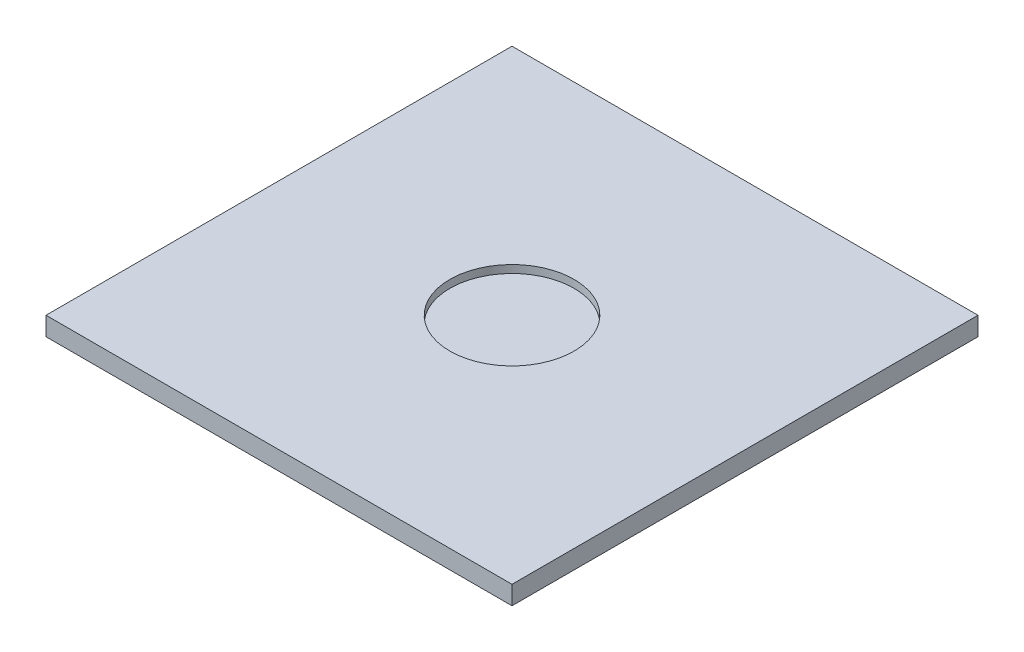
ISO-10303-21;
HEADER;
FILE_DESCRIPTION(('STEP AP214'),'2;1');
FILE_NAME('part.step','',(''),(''),'','','');
FILE_SCHEMA(('AUTOMOTIVE_DESIGN { 1 0 10303 214 1 1 1 1 }'));
ENDSEC;
DATA;
#1=APPLICATION_CONTEXT('core data for automotive mechanical design processes');
#2=APPLICATION_PROTOCOL_DEFINITION('international standard','automotive_design',2000,#1);
#3=PRODUCT_CONTEXT('',#1,'mechanical');
#4=PRODUCT('Part','Part','',(#3));
#5=PRODUCT_RELATED_PRODUCT_CATEGORY('part','',(#4));
#6=PRODUCT_DEFINITION_FORMATION('','',#4);
#7=PRODUCT_DEFINITION_CONTEXT('part definition',#1,'design');
#8=PRODUCT_DEFINITION('design','',#6,#7);
#9=PRODUCT_DEFINITION_SHAPE('','',#8);
#10=(LENGTH_UNIT() NAMED_UNIT(*) SI_UNIT(.MILLI.,.METRE.));
#11=(NAMED_UNIT(*) PLANE_ANGLE_UNIT() SI_UNIT($,.RADIAN.));
#12=(NAMED_UNIT(*) SI_UNIT($,.STERADIAN.) SOLID_ANGLE_UNIT());
#13=UNCERTAINTY_MEASURE_WITH_UNIT(LENGTH_MEASURE(1.E-05),#10,'distance_accuracy_value','');
#14=(GEOMETRIC_REPRESENTATION_CONTEXT(3) GLOBAL_UNCERTAINTY_ASSIGNED_CONTEXT((#13)) GLOBAL_UNIT_ASSIGNED_CONTEXT((#10,
#11,#12)) REPRESENTATION_CONTEXT('',''));
#15=CARTESIAN_POINT('',(0.,0.,0.));
#16=DIRECTION('',(0.,0.,1.));
#17=DIRECTION('',(1.,0.,0.));
#18=AXIS2_PLACEMENT_3D('',#15,#16,#17);
#19=CARTESIAN_POINT('',(150.,12.,-150.));
#20=DIRECTION('',(-1.,0.,0.));
#21=DIRECTION('',(0.,0.,1.));
#22=AXIS2_PLACEMENT_3D('',#19,#20,#21);
#23=PLANE('',#22);
#24=DIRECTION('',(0.,0.,-1.));
#25=VECTOR('',#24,1.);
#26=CARTESIAN_POINT('',(150.,0.,-150.));
#27=LINE('',#26,#25);
#28=CARTESIAN_POINT('',(150.,0.,150.));
#29=VERTEX_POINT('',#28);
#30=CARTESIAN_POINT('',(150.,0.,-150.));
#31=VERTEX_POINT('',#30);
#32=EDGE_CURVE('E84',#29,#31,#27,.T.);
#33=ORIENTED_EDGE('',*,*,#32,.T.);
#34=DIRECTION('',(0.,-1.,0.));
#35=VECTOR('',#34,1.);
#36=CARTESIAN_POINT('',(150.,12.,-150.));
#37=LINE('',#36,#35);
#38=CARTESIAN_POINT('',(150.,12.,-150.));
#39=VERTEX_POINT('',#38);
#40=EDGE_CURVE('E9',#39,#31,#37,.T.);
#41=ORIENTED_EDGE('',*,*,#40,.F.);
#42=DIRECTION('',(0.,0.,-1.));
#43=VECTOR('',#42,1.);
#44=CARTESIAN_POINT('',(150.,12.,-150.));
#45=LINE('',#44,#43);
#46=CARTESIAN_POINT('',(150.,12.,150.));
#47=VERTEX_POINT('',#46);
#48=EDGE_CURVE('E67',#47,#39,#45,.T.);
#49=ORIENTED_EDGE('',*,*,#48,.F.);
#50=DIRECTION('',(0.,-1.,0.));
#51=VECTOR('',#50,1.);
#52=CARTESIAN_POINT('',(150.,12.,150.));
#53=LINE('',#52,#51);
#54=EDGE_CURVE('E80',#47,#29,#53,.T.);
#55=ORIENTED_EDGE('',*,*,#54,.T.);
#56=EDGE_LOOP('',(#33,#41,#49,#55));
#57=FACE_BOUND('',#56,.T.);
#58=ADVANCED_FACE('F15',(#57),#23,.F.);
#59=CARTESIAN_POINT('',(-150.,12.,-150.));
#60=DIRECTION('',(0.,0.,1.));
#61=DIRECTION('',(1.,0.,0.));
#62=AXIS2_PLACEMENT_3D('',#59,#60,#61);
#63=PLANE('',#62);
#64=DIRECTION('',(-1.,0.,0.));
#65=VECTOR('',#64,1.);
#66=CARTESIAN_POINT('',(-150.,0.,-150.));
#67=LINE('',#66,#65);
#68=CARTESIAN_POINT('',(-150.,0.,-150.));
#69=VERTEX_POINT('',#68);
#70=EDGE_CURVE('E72',#31,#69,#67,.T.);
#71=ORIENTED_EDGE('',*,*,#70,.T.);
#72=DIRECTION('',(0.,-1.,0.));
#73=VECTOR('',#72,1.);
#74=CARTESIAN_POINT('',(-150.,12.,-150.));
#75=LINE('',#74,#73);
#76=CARTESIAN_POINT('',(-150.,12.,-150.));
#77=VERTEX_POINT('',#76);
#78=EDGE_CURVE('E24',#77,#69,#75,.T.);
#79=ORIENTED_EDGE('',*,*,#78,.F.);
#80=DIRECTION('',(-1.,0.,0.));
#81=VECTOR('',#80,1.);
#82=CARTESIAN_POINT('',(-150.,12.,-150.));
#83=LINE('',#82,#81);
#84=EDGE_CURVE('E62',#39,#77,#83,.T.);
#85=ORIENTED_EDGE('',*,*,#84,.F.);
#86=ORIENTED_EDGE('',*,*,#40,.T.);
#87=EDGE_LOOP('',(#71,#79,#85,#86));
#88=FACE_BOUND('',#87,.T.);
#89=ADVANCED_FACE('F71',(#88),#63,.F.);
#90=CARTESIAN_POINT('',(-150.,12.,-150.));
#91=DIRECTION('',(1.,0.,0.));
#92=DIRECTION('',(0.,0.,-1.));
#93=AXIS2_PLACEMENT_3D('',#90,#91,#92);
#94=PLANE('',#93);
#95=DIRECTION('',(0.,0.,1.));
#96=VECTOR('',#95,1.);
#97=CARTESIAN_POINT('',(-150.,0.,-150.));
#98=LINE('',#97,#96);
#99=CARTESIAN_POINT('',(-150.,0.,150.));
#100=VERTEX_POINT('',#99);
#101=EDGE_CURVE('E49',#69,#100,#98,.T.);
#102=ORIENTED_EDGE('',*,*,#101,.T.);
#103=DIRECTION('',(0.,-1.,0.));
#104=VECTOR('',#103,1.);
#105=CARTESIAN_POINT('',(-150.,12.,150.));
#106=LINE('',#105,#104);
#107=CARTESIAN_POINT('',(-150.,12.,150.));
#108=VERTEX_POINT('',#107);
#109=EDGE_CURVE('E74',#108,#100,#106,.T.);
#110=ORIENTED_EDGE('',*,*,#109,.F.);
#111=DIRECTION('',(0.,0.,1.));
#112=VECTOR('',#111,1.);
#113=CARTESIAN_POINT('',(-150.,12.,-150.));
#114=LINE('',#113,#112);
#115=EDGE_CURVE('E65',#77,#108,#114,.T.);
#116=ORIENTED_EDGE('',*,*,#115,.F.);
#117=ORIENTED_EDGE('',*,*,#78,.T.);
#118=EDGE_LOOP('',(#102,#110,#116,#117));
#119=FACE_BOUND('',#118,.T.);
#120=ADVANCED_FACE('F75',(#119),#94,.F.);
#121=CARTESIAN_POINT('',(-150.,12.,150.));
#122=DIRECTION('',(0.,0.,-1.));
#123=DIRECTION('',(-1.,0.,0.));
#124=AXIS2_PLACEMENT_3D('',#121,#122,#123);
#125=PLANE('',#124);
#126=DIRECTION('',(1.,0.,0.));
#127=VECTOR('',#126,1.);
#128=CARTESIAN_POINT('',(-150.,0.,150.));
#129=LINE('',#128,#127);
#130=EDGE_CURVE('E55',#100,#29,#129,.T.);
#131=ORIENTED_EDGE('',*,*,#130,.T.);
#132=ORIENTED_EDGE('',*,*,#54,.F.);
#133=DIRECTION('',(1.,0.,0.));
#134=VECTOR('',#133,1.);
#135=CARTESIAN_POINT('',(-150.,12.,150.));
#136=LINE('',#135,#134);
#137=EDGE_CURVE('E32',#108,#47,#136,.T.);
#138=ORIENTED_EDGE('',*,*,#137,.F.);
#139=ORIENTED_EDGE('',*,*,#109,.T.);
#140=EDGE_LOOP('',(#131,#132,#138,#139));
#141=FACE_BOUND('',#140,.T.);
#142=ADVANCED_FACE('F98',(#141),#125,.F.);
#143=CARTESIAN_POINT('',(0.,12.,0.));
#144=DIRECTION('',(0.,1.,0.));
#145=DIRECTION('',(0.,0.,1.));
#146=AXIS2_PLACEMENT_3D('',#143,#144,#145);
#147=PLANE('',#146);
#148=CARTESIAN_POINT('',(0.,12.,0.));
#149=DIRECTION('',(0.,1.,0.));
#150=DIRECTION('',(0.,0.,1.));
#151=AXIS2_PLACEMENT_3D('',#148,#149,#150);
#152=CIRCLE('',#151,40.);
#153=CARTESIAN_POINT('',(0.,12.,40.));
#154=VERTEX_POINT('',#153);
#155=EDGE_CURVE('E105',#154,#154,#152,.T.);
#156=ORIENTED_EDGE('',*,*,#155,.F.);
#157=EDGE_LOOP('',(#156));
#158=FACE_BOUND('',#157,.T.);
#159=ORIENTED_EDGE('',*,*,#48,.T.);
#160=ORIENTED_EDGE('',*,*,#84,.T.);
#161=ORIENTED_EDGE('',*,*,#115,.T.);
#162=ORIENTED_EDGE('',*,*,#137,.T.);
#163=EDGE_LOOP('',(#159,#160,#161,#162));
#164=FACE_BOUND('',#163,.T.);
#165=ADVANCED_FACE('F63',(#158,#164),#147,.T.);
#166=CARTESIAN_POINT('',(0.,0.,0.));
#167=DIRECTION('',(0.,1.,0.));
#168=DIRECTION('',(0.,0.,1.));
#169=AXIS2_PLACEMENT_3D('',#166,#167,#168);
#170=PLANE('',#169);
#171=ORIENTED_EDGE('',*,*,#32,.F.);
#172=ORIENTED_EDGE('',*,*,#130,.F.);
#173=ORIENTED_EDGE('',*,*,#101,.F.);
#174=ORIENTED_EDGE('',*,*,#70,.F.);
#175=EDGE_LOOP('',(#171,#172,#173,#174));
#176=FACE_BOUND('',#175,.T.);
#177=ADVANCED_FACE('F101',(#176),#170,.F.);
#178=CARTESIAN_POINT('',(0.,7.,0.));
#179=DIRECTION('',(0.,1.,0.));
#180=DIRECTION('',(0.,0.,1.));
#181=AXIS2_PLACEMENT_3D('',#178,#179,#180);
#182=CYLINDRICAL_SURFACE('',#181,40.);
#183=CARTESIAN_POINT('',(0.,7.,0.));
#184=DIRECTION('',(0.,1.,0.));
#185=DIRECTION('',(0.,0.,1.));
#186=AXIS2_PLACEMENT_3D('',#183,#184,#185);
#187=CIRCLE('',#186,40.);
#188=CARTESIAN_POINT('',(0.,7.,40.));
#189=VERTEX_POINT('',#188);
#190=EDGE_CURVE('E88',#189,#189,#187,.T.);
#191=ORIENTED_EDGE('',*,*,#190,.F.);
#192=EDGE_LOOP('',(#191));
#193=FACE_BOUND('',#192,.T.);
#194=ORIENTED_EDGE('',*,*,#155,.T.);
#195=EDGE_LOOP('',(#194));
#196=FACE_BOUND('',#195,.T.);
#197=ADVANCED_FACE('F115',(#193,#196),#182,.F.);
#198=CARTESIAN_POINT('',(0.,7.,0.));
#199=DIRECTION('',(0.,1.,0.));
#200=DIRECTION('',(0.,0.,1.));
#201=AXIS2_PLACEMENT_3D('',#198,#199,#200);
#202=PLANE('',#201);
#203=ORIENTED_EDGE('',*,*,#190,.T.);
#204=EDGE_LOOP('',(#203));
#205=FACE_BOUND('',#204,.T.);
#206=ADVANCED_FACE('F113',(#205),#202,.T.);
#207=CLOSED_SHELL('',(#58,#89,#120,#142,#165,#177,#197,#206));
#208=MANIFOLD_SOLID_BREP('B1',#207);
#209=ADVANCED_BREP_SHAPE_REPRESENTATION('',(#18,#208),#14);
#210=SHAPE_DEFINITION_REPRESENTATION(#9,#209);
ENDSEC;
END-ISO-10303-21;
